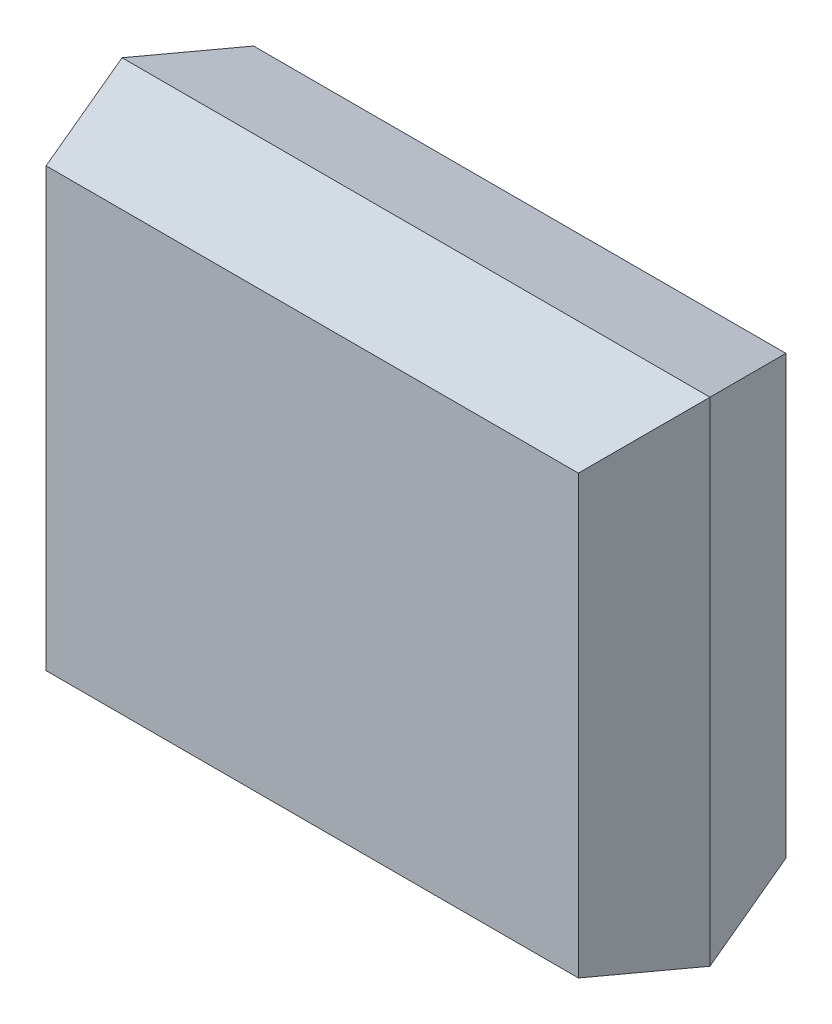
ISO-10303-21;
HEADER;
FILE_DESCRIPTION(('STEP AP214'),'2;1');
FILE_NAME('part.step','',(''),(''),'','','');
FILE_SCHEMA(('AUTOMOTIVE_DESIGN { 1 0 10303 214 1 1 1 1 }'));
ENDSEC;
DATA;
#1=APPLICATION_CONTEXT('core data for automotive mechanical design processes');
#2=APPLICATION_PROTOCOL_DEFINITION('international standard','automotive_design',2000,#1);
#3=PRODUCT_CONTEXT('',#1,'mechanical');
#4=PRODUCT('Part','Part','',(#3));
#5=PRODUCT_RELATED_PRODUCT_CATEGORY('part','',(#4));
#6=PRODUCT_DEFINITION_FORMATION('','',#4);
#7=PRODUCT_DEFINITION_CONTEXT('part definition',#1,'design');
#8=PRODUCT_DEFINITION('design','',#6,#7);
#9=PRODUCT_DEFINITION_SHAPE('','',#8);
#10=(LENGTH_UNIT() NAMED_UNIT(*) SI_UNIT(.MILLI.,.METRE.));
#11=(NAMED_UNIT(*) PLANE_ANGLE_UNIT() SI_UNIT($,.RADIAN.));
#12=(NAMED_UNIT(*) SI_UNIT($,.STERADIAN.) SOLID_ANGLE_UNIT());
#13=UNCERTAINTY_MEASURE_WITH_UNIT(LENGTH_MEASURE(1.E-05),#10,'distance_accuracy_value','');
#14=(GEOMETRIC_REPRESENTATION_CONTEXT(3) GLOBAL_UNCERTAINTY_ASSIGNED_CONTEXT((#13)) GLOBAL_UNIT_ASSIGNED_CONTEXT((#10,
#11,#12)) REPRESENTATION_CONTEXT('',''));
#15=CARTESIAN_POINT('',(0.,0.,0.));
#16=DIRECTION('',(0.,0.,1.));
#17=DIRECTION('',(1.,0.,0.));
#18=AXIS2_PLACEMENT_3D('',#15,#16,#17);
#19=CARTESIAN_POINT('',(0.,0.,0.));
#20=DIRECTION('',(-0.965925826289068,0.,-0.258819045102521));
#21=DIRECTION('',(-0.258819045102521,0.,0.965925826289068));
#22=AXIS2_PLACEMENT_3D('',#19,#20,#21);
#23=PLANE('',#22);
#24=DIRECTION('',(0.,-1.,0.));
#25=VECTOR('',#24,1.);
#26=CARTESIAN_POINT('',(0.,0.,0.));
#27=LINE('',#26,#25);
#28=CARTESIAN_POINT('',(0.,0.,0.));
#29=VERTEX_POINT('',#28);
#30=CARTESIAN_POINT('',(0.,-5.7,0.));
#31=VERTEX_POINT('',#30);
#32=EDGE_CURVE('E11',#29,#31,#27,.T.);
#33=ORIENTED_EDGE('',*,*,#32,.F.);
#34=DIRECTION('',(-0.250562807085732,0.250562807085732,0.935113126531029));
#35=VECTOR('',#34,1.);
#36=CARTESIAN_POINT('',(0.,0.,0.));
#37=LINE('',#36,#35);
#38=CARTESIAN_POINT('',(0.321539030917348,-0.321539030917348,-1.2));
#39=VERTEX_POINT('',#38);
#40=EDGE_CURVE('E24',#39,#29,#37,.T.);
#41=ORIENTED_EDGE('',*,*,#40,.F.);
#42=DIRECTION('',(0.,-1.,0.));
#43=VECTOR('',#42,1.);
#44=CARTESIAN_POINT('',(0.321539030917349,-5.7,-1.2));
#45=LINE('',#44,#43);
#46=CARTESIAN_POINT('',(0.321539030917349,-5.37846096908265,-1.2));
#47=VERTEX_POINT('',#46);
#48=EDGE_CURVE('E122',#39,#47,#45,.T.);
#49=ORIENTED_EDGE('',*,*,#48,.T.);
#50=DIRECTION('',(-0.250562807085732,-0.250562807085732,0.935113126531029));
#51=VECTOR('',#50,1.);
#52=CARTESIAN_POINT('',(0.357855805679687,-5.34214419432031,-1.33553604858008));
#53=LINE('',#52,#51);
#54=EDGE_CURVE('E120',#47,#31,#53,.T.);
#55=ORIENTED_EDGE('',*,*,#54,.T.);
#56=EDGE_LOOP('',(#33,#41,#49,#55));
#57=FACE_BOUND('',#56,.T.);
#58=ADVANCED_FACE('F17',(#57),#23,.T.);
#59=CARTESIAN_POINT('',(0.,0.,0.));
#60=DIRECTION('',(0.,0.965925826289068,-0.258819045102521));
#61=DIRECTION('',(0.,0.258819045102521,0.965925826289068));
#62=AXIS2_PLACEMENT_3D('',#59,#60,#61);
#63=PLANE('',#62);
#64=DIRECTION('',(-1.,0.,0.));
#65=VECTOR('',#64,1.);
#66=CARTESIAN_POINT('',(0.,0.,0.));
#67=LINE('',#66,#65);
#68=CARTESIAN_POINT('',(6.8,0.,0.));
#69=VERTEX_POINT('',#68);
#70=EDGE_CURVE('E118',#69,#29,#67,.T.);
#71=ORIENTED_EDGE('',*,*,#70,.F.);
#72=DIRECTION('',(0.250562807085732,0.250562807085732,0.935113126531029));
#73=VECTOR('',#72,1.);
#74=CARTESIAN_POINT('',(6.8,0.,0.));
#75=LINE('',#74,#73);
#76=CARTESIAN_POINT('',(6.47846096908265,-0.321539030917348,-1.2));
#77=VERTEX_POINT('',#76);
#78=EDGE_CURVE('E115',#77,#69,#75,.T.);
#79=ORIENTED_EDGE('',*,*,#78,.F.);
#80=DIRECTION('',(-1.,0.,0.));
#81=VECTOR('',#80,1.);
#82=CARTESIAN_POINT('',(0.,-0.321539030917349,-1.2));
#83=LINE('',#82,#81);
#84=EDGE_CURVE('E112',#77,#39,#83,.T.);
#85=ORIENTED_EDGE('',*,*,#84,.T.);
#86=ORIENTED_EDGE('',*,*,#40,.T.);
#87=EDGE_LOOP('',(#71,#79,#85,#86));
#88=FACE_BOUND('',#87,.T.);
#89=ADVANCED_FACE('F124',(#88),#63,.T.);
#90=CARTESIAN_POINT('',(6.8,0.,0.));
#91=DIRECTION('',(0.965925826289068,0.,-0.258819045102521));
#92=DIRECTION('',(-0.258819045102521,0.,-0.965925826289068));
#93=AXIS2_PLACEMENT_3D('',#90,#91,#92);
#94=PLANE('',#93);
#95=DIRECTION('',(0.,1.,0.));
#96=VECTOR('',#95,1.);
#97=CARTESIAN_POINT('',(6.8,0.,0.));
#98=LINE('',#97,#96);
#99=CARTESIAN_POINT('',(6.8,-5.7,0.));
#100=VERTEX_POINT('',#99);
#101=EDGE_CURVE('E71',#100,#69,#98,.T.);
#102=ORIENTED_EDGE('',*,*,#101,.F.);
#103=DIRECTION('',(0.250562807085732,-0.250562807085732,0.935113126531029));
#104=VECTOR('',#103,1.);
#105=CARTESIAN_POINT('',(6.37308430199616,-5.27308430199616,-1.59327107549904));
#106=LINE('',#105,#104);
#107=CARTESIAN_POINT('',(6.47846096908265,-5.37846096908265,-1.2));
#108=VERTEX_POINT('',#107);
#109=EDGE_CURVE('E108',#108,#100,#106,.T.);
#110=ORIENTED_EDGE('',*,*,#109,.F.);
#111=DIRECTION('',(0.,1.,0.));
#112=VECTOR('',#111,1.);
#113=CARTESIAN_POINT('',(6.47846096908265,-5.7,-1.2));
#114=LINE('',#113,#112);
#115=EDGE_CURVE('E105',#108,#77,#114,.T.);
#116=ORIENTED_EDGE('',*,*,#115,.T.);
#117=ORIENTED_EDGE('',*,*,#78,.T.);
#118=EDGE_LOOP('',(#102,#110,#116,#117));
#119=FACE_BOUND('',#118,.T.);
#120=ADVANCED_FACE('F137',(#119),#94,.T.);
#121=CARTESIAN_POINT('',(0.,-5.7,0.));
#122=DIRECTION('',(0.,-0.965925826289068,-0.258819045102521));
#123=DIRECTION('',(0.,0.258819045102521,-0.965925826289068));
#124=AXIS2_PLACEMENT_3D('',#121,#122,#123);
#125=PLANE('',#124);
#126=DIRECTION('',(1.,0.,0.));
#127=VECTOR('',#126,1.);
#128=CARTESIAN_POINT('',(0.,-5.7,0.));
#129=LINE('',#128,#127);
#130=EDGE_CURVE('E102',#31,#100,#129,.T.);
#131=ORIENTED_EDGE('',*,*,#130,.F.);
#132=ORIENTED_EDGE('',*,*,#54,.F.);
#133=DIRECTION('',(1.,0.,0.));
#134=VECTOR('',#133,1.);
#135=CARTESIAN_POINT('',(0.,-5.37846096908265,-1.2));
#136=LINE('',#135,#134);
#137=EDGE_CURVE('E99',#47,#108,#136,.T.);
#138=ORIENTED_EDGE('',*,*,#137,.T.);
#139=ORIENTED_EDGE('',*,*,#109,.T.);
#140=EDGE_LOOP('',(#131,#132,#138,#139));
#141=FACE_BOUND('',#140,.T.);
#142=ADVANCED_FACE('F133',(#141),#125,.T.);
#143=CARTESIAN_POINT('',(0.,-5.7,-1.2));
#144=DIRECTION('',(0.,0.,1.));
#145=DIRECTION('',(1.,0.,0.));
#146=AXIS2_PLACEMENT_3D('',#143,#144,#145);
#147=PLANE('',#146);
#148=ORIENTED_EDGE('',*,*,#48,.F.);
#149=ORIENTED_EDGE('',*,*,#84,.F.);
#150=ORIENTED_EDGE('',*,*,#115,.F.);
#151=ORIENTED_EDGE('',*,*,#137,.F.);
#152=EDGE_LOOP('',(#148,#149,#150,#151));
#153=FACE_BOUND('',#152,.T.);
#154=ADVANCED_FACE('F139',(#153),#147,.F.);
#155=CARTESIAN_POINT('',(0.,0.,0.));
#156=DIRECTION('',(-0.965925826289068,0.,0.258819045102521));
#157=DIRECTION('',(0.258819045102521,0.,0.965925826289068));
#158=AXIS2_PLACEMENT_3D('',#155,#156,#157);
#159=PLANE('',#158);
#160=ORIENTED_EDGE('',*,*,#32,.T.);
#161=DIRECTION('',(-0.250562807085732,-0.250562807085732,-0.935113126531029));
#162=VECTOR('',#161,1.);
#163=CARTESIAN_POINT('',(0.,-5.7,0.));
#164=LINE('',#163,#162);
#165=CARTESIAN_POINT('',(0.321539030917349,-5.37846096908265,1.2));
#166=VERTEX_POINT('',#165);
#167=EDGE_CURVE('E96',#166,#31,#164,.T.);
#168=ORIENTED_EDGE('',*,*,#167,.F.);
#169=DIRECTION('',(0.,-1.,0.));
#170=VECTOR('',#169,1.);
#171=CARTESIAN_POINT('',(0.321539030917348,0.,1.2));
#172=LINE('',#171,#170);
#173=CARTESIAN_POINT('',(0.321539030917348,-0.321539030917348,1.2));
#174=VERTEX_POINT('',#173);
#175=EDGE_CURVE('E94',#174,#166,#172,.T.);
#176=ORIENTED_EDGE('',*,*,#175,.F.);
#177=DIRECTION('',(-0.250562807085732,0.250562807085732,-0.935113126531029));
#178=VECTOR('',#177,1.);
#179=CARTESIAN_POINT('',(0.,0.,0.));
#180=LINE('',#179,#178);
#181=EDGE_CURVE('E87',#174,#29,#180,.T.);
#182=ORIENTED_EDGE('',*,*,#181,.T.);
#183=EDGE_LOOP('',(#160,#168,#176,#182));
#184=FACE_BOUND('',#183,.T.);
#185=ADVANCED_FACE('F127',(#184),#159,.T.);
#186=CARTESIAN_POINT('',(0.,-5.7,0.));
#187=DIRECTION('',(0.,-0.965925826289068,0.258819045102521));
#188=DIRECTION('',(0.,-0.258819045102521,-0.965925826289068));
#189=AXIS2_PLACEMENT_3D('',#186,#187,#188);
#190=PLANE('',#189);
#191=ORIENTED_EDGE('',*,*,#130,.T.);
#192=DIRECTION('',(0.250562807085732,-0.250562807085732,-0.935113126531029));
#193=VECTOR('',#192,1.);
#194=CARTESIAN_POINT('',(6.44214419432031,-5.34214419432031,1.33553604858008));
#195=LINE('',#194,#193);
#196=CARTESIAN_POINT('',(6.47846096908265,-5.37846096908265,1.2));
#197=VERTEX_POINT('',#196);
#198=EDGE_CURVE('E91',#197,#100,#195,.T.);
#199=ORIENTED_EDGE('',*,*,#198,.F.);
#200=DIRECTION('',(1.,0.,0.));
#201=VECTOR('',#200,1.);
#202=CARTESIAN_POINT('',(0.,-5.37846096908265,1.2));
#203=LINE('',#202,#201);
#204=EDGE_CURVE('E75',#166,#197,#203,.T.);
#205=ORIENTED_EDGE('',*,*,#204,.F.);
#206=ORIENTED_EDGE('',*,*,#167,.T.);
#207=EDGE_LOOP('',(#191,#199,#205,#206));
#208=FACE_BOUND('',#207,.T.);
#209=ADVANCED_FACE('F129',(#208),#190,.T.);
#210=CARTESIAN_POINT('',(6.8,0.,0.));
#211=DIRECTION('',(0.965925826289068,0.,0.258819045102521));
#212=DIRECTION('',(0.258819045102521,0.,-0.965925826289068));
#213=AXIS2_PLACEMENT_3D('',#210,#211,#212);
#214=PLANE('',#213);
#215=ORIENTED_EDGE('',*,*,#101,.T.);
#216=DIRECTION('',(0.250562807085732,0.250562807085732,-0.935113126531029));
#217=VECTOR('',#216,1.);
#218=CARTESIAN_POINT('',(6.37308430199616,-0.426915698003836,1.59327107549904));
#219=LINE('',#218,#217);
#220=CARTESIAN_POINT('',(6.47846096908265,-0.321539030917348,1.2));
#221=VERTEX_POINT('',#220);
#222=EDGE_CURVE('E66',#221,#69,#219,.T.);
#223=ORIENTED_EDGE('',*,*,#222,.F.);
#224=DIRECTION('',(0.,1.,0.));
#225=VECTOR('',#224,1.);
#226=CARTESIAN_POINT('',(6.47846096908265,0.,1.2));
#227=LINE('',#226,#225);
#228=EDGE_CURVE('E70',#197,#221,#227,.T.);
#229=ORIENTED_EDGE('',*,*,#228,.F.);
#230=ORIENTED_EDGE('',*,*,#198,.T.);
#231=EDGE_LOOP('',(#215,#223,#229,#230));
#232=FACE_BOUND('',#231,.T.);
#233=ADVANCED_FACE('F68',(#232),#214,.T.);
#234=CARTESIAN_POINT('',(0.,0.,0.));
#235=DIRECTION('',(0.,0.965925826289068,0.258819045102521));
#236=DIRECTION('',(0.,-0.258819045102521,0.965925826289068));
#237=AXIS2_PLACEMENT_3D('',#234,#235,#236);
#238=PLANE('',#237);
#239=ORIENTED_EDGE('',*,*,#70,.T.);
#240=ORIENTED_EDGE('',*,*,#181,.F.);
#241=DIRECTION('',(-1.,0.,0.));
#242=VECTOR('',#241,1.);
#243=CARTESIAN_POINT('',(0.,-0.321539030917348,1.2));
#244=LINE('',#243,#242);
#245=EDGE_CURVE('E82',#221,#174,#244,.T.);
#246=ORIENTED_EDGE('',*,*,#245,.F.);
#247=ORIENTED_EDGE('',*,*,#222,.T.);
#248=EDGE_LOOP('',(#239,#240,#246,#247));
#249=FACE_BOUND('',#248,.T.);
#250=ADVANCED_FACE('F86',(#249),#238,.T.);
#251=CARTESIAN_POINT('',(0.,-5.7,1.2));
#252=DIRECTION('',(0.,0.,1.));
#253=DIRECTION('',(1.,0.,0.));
#254=AXIS2_PLACEMENT_3D('',#251,#252,#253);
#255=PLANE('',#254);
#256=ORIENTED_EDGE('',*,*,#175,.T.);
#257=ORIENTED_EDGE('',*,*,#204,.T.);
#258=ORIENTED_EDGE('',*,*,#228,.T.);
#259=ORIENTED_EDGE('',*,*,#245,.T.);
#260=EDGE_LOOP('',(#256,#257,#258,#259));
#261=FACE_BOUND('',#260,.T.);
#262=ADVANCED_FACE('F81',(#261),#255,.T.);
#263=CLOSED_SHELL('',(#58,#89,#120,#142,#154,#185,#209,#233,#250,#262));
#264=MANIFOLD_SOLID_BREP('B1',#263);
#265=ADVANCED_BREP_SHAPE_REPRESENTATION('',(#18,#264),#14);
#266=SHAPE_DEFINITION_REPRESENTATION(#9,#265);
ENDSEC;
END-ISO-10303-21;
